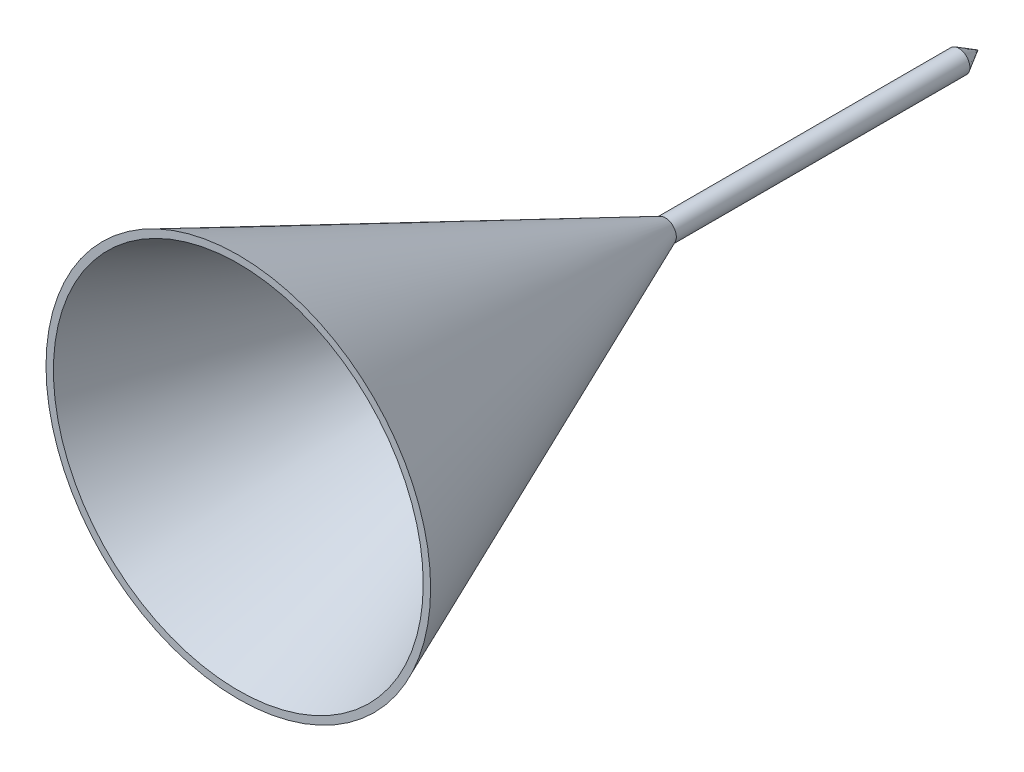
ISO-10303-21;
HEADER;
FILE_DESCRIPTION(('STEP AP214'),'2;1');
FILE_NAME('part.step','',(''),(''),'','','');
FILE_SCHEMA(('AUTOMOTIVE_DESIGN { 1 0 10303 214 1 1 1 1 }'));
ENDSEC;
DATA;
#1=APPLICATION_CONTEXT('core data for automotive mechanical design processes');
#2=APPLICATION_PROTOCOL_DEFINITION('international standard','automotive_design',2000,#1);
#3=PRODUCT_CONTEXT('',#1,'mechanical');
#4=PRODUCT('Part','Part','',(#3));
#5=PRODUCT_RELATED_PRODUCT_CATEGORY('part','',(#4));
#6=PRODUCT_DEFINITION_FORMATION('','',#4);
#7=PRODUCT_DEFINITION_CONTEXT('part definition',#1,'design');
#8=PRODUCT_DEFINITION('design','',#6,#7);
#9=PRODUCT_DEFINITION_SHAPE('','',#8);
#10=(LENGTH_UNIT() NAMED_UNIT(*) SI_UNIT(.MILLI.,.METRE.));
#11=(NAMED_UNIT(*) PLANE_ANGLE_UNIT() SI_UNIT($,.RADIAN.));
#12=(NAMED_UNIT(*) SI_UNIT($,.STERADIAN.) SOLID_ANGLE_UNIT());
#13=UNCERTAINTY_MEASURE_WITH_UNIT(LENGTH_MEASURE(1.E-05),#10,'distance_accuracy_value','');
#14=(GEOMETRIC_REPRESENTATION_CONTEXT(3) GLOBAL_UNCERTAINTY_ASSIGNED_CONTEXT((#13)) GLOBAL_UNIT_ASSIGNED_CONTEXT((#10,
#11,#12)) REPRESENTATION_CONTEXT('',''));
#15=CARTESIAN_POINT('',(0.,0.,0.));
#16=DIRECTION('',(0.,0.,1.));
#17=DIRECTION('',(1.,0.,0.));
#18=AXIS2_PLACEMENT_3D('',#15,#16,#17);
#19=CARTESIAN_POINT('',(0.,0.,-8796.28156351262));
#20=DIRECTION('',(0.,0.,1.));
#21=DIRECTION('',(1.,0.,0.));
#22=AXIS2_PLACEMENT_3D('',#19,#20,#21);
#23=CONICAL_SURFACE('',#22,76.2000000000001,0.4014257279587);
#24=CARTESIAN_POINT('',(0.,0.,0.));
#25=DIRECTION('',(0.,0.,1.));
#26=DIRECTION('',(1.,0.,0.));
#27=AXIS2_PLACEMENT_3D('',#24,#25,#26);
#28=CIRCLE('',#27,3810.);
#29=CARTESIAN_POINT('',(3810.,0.,-1.77635683940025E-12));
#30=VERTEX_POINT('',#29);
#31=EDGE_CURVE('E66',#30,#30,#28,.T.);
#32=CARTESIAN_POINT('',(0.,0.,-8796.28156351262));
#33=DIRECTION('',(0.,0.,1.));
#34=DIRECTION('',(1.,0.,0.));
#35=AXIS2_PLACEMENT_3D('',#32,#33,#34);
#36=CIRCLE('',#35,76.2000000000001);
#37=CARTESIAN_POINT('',(76.1999999999997,0.,-8796.28156351262));
#38=VERTEX_POINT('',#37);
#39=EDGE_CURVE('E11',#38,#38,#36,.T.);
#40=CARTESIAN_POINT('',(3810.,0.,-1.77635683940025E-12));
#41=CARTESIAN_POINT('',(3771.10625,0.,-91.6279329532577));
#42=CARTESIAN_POINT('',(3732.2125,0.,-183.255865906514));
#43=CARTESIAN_POINT('',(3654.425,0.,-366.511731813027));
#44=CARTESIAN_POINT('',(3615.53125,0.,-458.139664766284));
#45=CARTESIAN_POINT('',(3537.74375,0.,-641.395530672797));
#46=CARTESIAN_POINT('',(3498.85,0.,-733.023463626054));
#47=CARTESIAN_POINT('',(3421.0625,0.,-916.279329532567));
#48=CARTESIAN_POINT('',(3382.16875,0.,-1007.90726248582));
#49=CARTESIAN_POINT('',(3304.38125,0.,-1191.16312839234));
#50=CARTESIAN_POINT('',(3265.4875,0.,-1282.79106134559));
#51=CARTESIAN_POINT('',(3187.7,0.,-1466.0469272521));
#52=CARTESIAN_POINT('',(3148.80625,0.,-1557.67486020536));
#53=CARTESIAN_POINT('',(3071.01875,0.,-1740.93072611187));
#54=CARTESIAN_POINT('',(3032.125,0.,-1832.55865906513));
#55=CARTESIAN_POINT('',(2954.3375,0.,-2015.81452497164));
#56=CARTESIAN_POINT('',(2915.44375,0.,-2107.4424579249));
#57=CARTESIAN_POINT('',(2837.65625,0.,-2290.69832383141));
#58=CARTESIAN_POINT('',(2798.7625,0.,-2382.32625678467));
#59=CARTESIAN_POINT('',(2720.975,0.,-2565.58212269118));
#60=CARTESIAN_POINT('',(2682.08125,0.,-2657.21005564444));
#61=CARTESIAN_POINT('',(2604.29375,0.,-2840.46592155095));
#62=CARTESIAN_POINT('',(2565.4,0.,-2932.09385450421));
#63=CARTESIAN_POINT('',(2487.6125,0.,-3115.34972041072));
#64=CARTESIAN_POINT('',(2448.71875,0.,-3206.97765336398));
#65=CARTESIAN_POINT('',(2370.93125,0.,-3390.23351927049));
#66=CARTESIAN_POINT('',(2332.0375,0.,-3481.86145222375));
#67=CARTESIAN_POINT('',(2254.25,0.,-3665.11731813026));
#68=CARTESIAN_POINT('',(2215.35625,0.,-3756.74525108352));
#69=CARTESIAN_POINT('',(2137.56875,0.,-3940.00111699003));
#70=CARTESIAN_POINT('',(2098.675,0.,-4031.62904994328));
#71=CARTESIAN_POINT('',(2020.8875,0.,-4214.8849158498));
#72=CARTESIAN_POINT('',(1981.99375,0.,-4306.51284880305));
#73=CARTESIAN_POINT('',(1904.20625,0.,-4489.76871470957));
#74=CARTESIAN_POINT('',(1865.3125,0.,-4581.39664766282));
#75=CARTESIAN_POINT('',(1787.525,0.,-4764.65251356934));
#76=CARTESIAN_POINT('',(1748.63125,0.,-4856.28044652259));
#77=CARTESIAN_POINT('',(1670.84375,0.,-5039.53631242911));
#78=CARTESIAN_POINT('',(1631.95,0.,-5131.16424538236));
#79=CARTESIAN_POINT('',(1554.1625,0.,-5314.42011128888));
#80=CARTESIAN_POINT('',(1515.26875,0.,-5406.04804424213));
#81=CARTESIAN_POINT('',(1437.48125,0.,-5589.30391014864));
#82=CARTESIAN_POINT('',(1398.5875,0.,-5680.9318431019));
#83=CARTESIAN_POINT('',(1320.8,0.,-5864.18770900841));
#84=CARTESIAN_POINT('',(1281.90625,0.,-5955.81564196167));
#85=CARTESIAN_POINT('',(1204.11875,0.,-6139.07150786818));
#86=CARTESIAN_POINT('',(1165.225,0.,-6230.69944082144));
#87=CARTESIAN_POINT('',(1087.4375,0.,-6413.95530672795));
#88=CARTESIAN_POINT('',(1048.54375,0.,-6505.58323968121));
#89=CARTESIAN_POINT('',(970.75625,0.,-6688.83910558772));
#90=CARTESIAN_POINT('',(931.8625,0.,-6780.46703854098));
#91=CARTESIAN_POINT('',(854.075,0.,-6963.72290444749));
#92=CARTESIAN_POINT('',(815.18125,0.,-7055.35083740075));
#93=CARTESIAN_POINT('',(737.39375,0.,-7238.60670330726));
#94=CARTESIAN_POINT('',(698.5,0.,-7330.23463626052));
#95=CARTESIAN_POINT('',(620.7125,0.,-7513.49050216703));
#96=CARTESIAN_POINT('',(581.81875,0.,-7605.11843512029));
#97=CARTESIAN_POINT('',(504.03125,0.,-7788.3743010268));
#98=CARTESIAN_POINT('',(465.1375,0.,-7880.00223398006));
#99=CARTESIAN_POINT('',(387.35,0.,-8063.25809988657));
#100=CARTESIAN_POINT('',(348.45625,0.,-8154.88603283982));
#101=CARTESIAN_POINT('',(270.66875,0.,-8338.14189874634));
#102=CARTESIAN_POINT('',(231.775,0.,-8429.7698316996));
#103=CARTESIAN_POINT('',(153.9875,0.,-8613.02569760611));
#104=CARTESIAN_POINT('',(115.09375,0.,-8704.65363055936));
#105=CARTESIAN_POINT('',(76.2000000000001,0.,-8796.28156351262));
#106=B_SPLINE_CURVE_WITH_KNOTS('',3,(#40,#41,#42,#43,#44,#45,#46,#47,#48,#49,#50,#51,#52,#53,
#54,#55,#56,#57,#58,#59,#60,#61,#62,#63,#64,#65,#66,#67,#68,#69,#70,#71,#72,#73,#74,#75,#76,#77,
#78,#79,#80,#81,#82,#83,#84,#85,#86,#87,#88,#89,#90,#91,#92,#93,#94,#95,#96,#97,#98,#99,#100,
#101,#102,#103,#104,#105),.UNSPECIFIED.,.F.,.F.,(4,2,2,2,2,2,2,2,2,2,2,2,2,2,2,2,2,2,2,2,2,2,2,
2,2,2,2,2,2,2,2,2,4),(0.,298.6228674719,597.245734943803,895.868602415704,1194.49146988761,
1493.11433735951,1791.73720483141,2090.36007230331,2388.98293977521,2687.60580724711,
2986.22867471901,3284.85154219091,3583.47440966281,3882.09727713472,4180.72014460662,
4479.34301207852,4777.96587955042,5076.58874702232,5375.21161449422,5673.83448196612,
5972.45734943802,6271.08021690993,6569.70308438183,6868.32595185373,7166.94881932563,
7465.57168679753,7764.19455426943,8062.81742174133,8361.44028921323,8660.06315668513,
8958.68602415703,9257.30889162894,9555.93175910084),.UNSPECIFIED.);
#107=EDGE_CURVE('BSEAM34',#30,#38,#106,.T.);
#108=ORIENTED_EDGE('',*,*,#31,.T.);
#109=ORIENTED_EDGE('',*,*,#39,.F.);
#110=ORIENTED_EDGE('',*,*,#107,.T.);
#111=ORIENTED_EDGE('',*,*,#107,.F.);
#112=EDGE_LOOP('',(#108,#110,#109,#111));
#113=FACE_BOUND('',#112,.T.);
#114=ADVANCED_FACE('F34',(#113),#23,.F.);
#115=CARTESIAN_POINT('',(0.,0.,0.));
#116=DIRECTION('',(0.,0.,1.));
#117=DIRECTION('',(1.,0.,0.));
#118=AXIS2_PLACEMENT_3D('',#115,#116,#117);
#119=CYLINDRICAL_SURFACE('',#118,76.2000000000001);
#120=ORIENTED_EDGE('',*,*,#39,.T.);
#121=EDGE_LOOP('',(#120));
#122=FACE_BOUND('',#121,.T.);
#123=CARTESIAN_POINT('',(0.,0.,-14879.4177284633));
#124=DIRECTION('',(0.,0.,1.));
#125=DIRECTION('',(1.,0.,0.));
#126=AXIS2_PLACEMENT_3D('',#123,#124,#125);
#127=CIRCLE('',#126,76.2);
#128=CARTESIAN_POINT('',(76.2,0.,-14879.4177284633));
#129=VERTEX_POINT('',#128);
#130=EDGE_CURVE('E41',#129,#129,#127,.T.);
#131=ORIENTED_EDGE('',*,*,#130,.F.);
#132=EDGE_LOOP('',(#131));
#133=FACE_BOUND('',#132,.T.);
#134=ADVANCED_FACE('F83',(#122,#133),#119,.F.);
#135=CARTESIAN_POINT('',(0.,0.,-15011.4));
#136=DIRECTION('',(0.,0.,1.));
#137=DIRECTION('',(1.,0.,0.));
#138=AXIS2_PLACEMENT_3D('',#135,#136,#137);
#139=CONICAL_SURFACE('',#138,0.,0.523598775598302);
#140=ORIENTED_EDGE('',*,*,#130,.T.);
#141=EDGE_LOOP('',(#140));
#142=FACE_BOUND('',#141,.T.);
#143=CARTESIAN_POINT('',(0.,0.,-15011.4));
#144=VERTEX_POINT('',#143);
#145=VERTEX_LOOP('',#144);
#146=FACE_BOUND('',#145,.T.);
#147=ADVANCED_FACE('F51',(#142,#146),#139,.F.);
#148=CARTESIAN_POINT('',(0.,0.,-14844.0531853898));
#149=DIRECTION('',(0.,0.,1.));
#150=DIRECTION('',(1.,0.,0.));
#151=AXIS2_PLACEMENT_3D('',#148,#149,#150);
#152=CONICAL_SURFACE('',#151,228.599999999998,0.523598775598302);
#153=CARTESIAN_POINT('',(0.,0.,-15240.));
#154=VERTEX_POINT('',#153);
#155=VERTEX_LOOP('',#154);
#156=FACE_BOUND('',#155,.T.);
#157=CARTESIAN_POINT('',(0.,0.,-14844.0531853898));
#158=DIRECTION('',(0.,0.,1.));
#159=DIRECTION('',(1.,0.,0.));
#160=AXIS2_PLACEMENT_3D('',#157,#158,#159);
#161=CIRCLE('',#160,228.599999999998);
#162=CARTESIAN_POINT('',(228.599999999998,0.,-14844.0531853898));
#163=VERTEX_POINT('',#162);
#164=EDGE_CURVE('E55',#163,#163,#161,.T.);
#165=ORIENTED_EDGE('',*,*,#164,.F.);
#166=EDGE_LOOP('',(#165));
#167=FACE_BOUND('',#166,.T.);
#168=ADVANCED_FACE('F47',(#156,#167),#152,.T.);
#169=CARTESIAN_POINT('',(0.,0.,0.));
#170=DIRECTION('',(0.,0.,1.));
#171=DIRECTION('',(1.,0.,0.));
#172=AXIS2_PLACEMENT_3D('',#169,#170,#171);
#173=CYLINDRICAL_SURFACE('',#172,228.599999999998);
#174=ORIENTED_EDGE('',*,*,#164,.T.);
#175=EDGE_LOOP('',(#174));
#176=FACE_BOUND('',#175,.T.);
#177=CARTESIAN_POINT('',(0.,0.,-8796.28156351262));
#178=DIRECTION('',(0.,0.,1.));
#179=DIRECTION('',(1.,0.,0.));
#180=AXIS2_PLACEMENT_3D('',#177,#178,#179);
#181=CIRCLE('',#180,228.599999999998);
#182=CARTESIAN_POINT('',(228.599999999998,0.,-8796.28156351262));
#183=VERTEX_POINT('',#182);
#184=EDGE_CURVE('E57',#183,#183,#181,.T.);
#185=ORIENTED_EDGE('',*,*,#184,.F.);
#186=EDGE_LOOP('',(#185));
#187=FACE_BOUND('',#186,.T.);
#188=ADVANCED_FACE('F50',(#176,#187),#173,.T.);
#189=CARTESIAN_POINT('',(0.,0.,0.));
#190=DIRECTION('',(0.,0.,1.));
#191=DIRECTION('',(1.,0.,0.));
#192=AXIS2_PLACEMENT_3D('',#189,#190,#191);
#193=CONICAL_SURFACE('',#192,3962.4,0.4014257279587);
#194=CARTESIAN_POINT('',(0.,0.,0.));
#195=DIRECTION('',(0.,0.,1.));
#196=DIRECTION('',(1.,0.,0.));
#197=AXIS2_PLACEMENT_3D('',#194,#195,#196);
#198=CIRCLE('',#197,3962.4);
#199=CARTESIAN_POINT('',(3962.4,0.,0.));
#200=VERTEX_POINT('',#199);
#201=EDGE_CURVE('E61',#200,#200,#198,.T.);
#202=CARTESIAN_POINT('',(228.599999999998,0.,-8796.28156351262));
#203=CARTESIAN_POINT('',(267.493749999998,0.,-8704.65363055937));
#204=CARTESIAN_POINT('',(306.387499999998,0.,-8613.02569760611));
#205=CARTESIAN_POINT('',(384.174999999998,0.,-8429.7698316996));
#206=CARTESIAN_POINT('',(423.068749999998,0.,-8338.14189874634));
#207=CARTESIAN_POINT('',(500.856249999998,0.,-8154.88603283983));
#208=CARTESIAN_POINT('',(539.749999999998,0.,-8063.25809988657));
#209=CARTESIAN_POINT('',(617.537499999998,0.,-7880.00223398006));
#210=CARTESIAN_POINT('',(656.431249999998,0.,-7788.3743010268));
#211=CARTESIAN_POINT('',(734.218749999998,0.,-7605.11843512029));
#212=CARTESIAN_POINT('',(773.112499999998,0.,-7513.49050216703));
#213=CARTESIAN_POINT('',(850.899999999998,0.,-7330.23463626052));
#214=CARTESIAN_POINT('',(889.793749999998,0.,-7238.60670330726));
#215=CARTESIAN_POINT('',(967.581249999998,0.,-7055.35083740075));
#216=CARTESIAN_POINT('',(1006.475,0.,-6963.72290444749));
#217=CARTESIAN_POINT('',(1084.2625,0.,-6780.46703854098));
#218=CARTESIAN_POINT('',(1123.15625,0.,-6688.83910558772));
#219=CARTESIAN_POINT('',(1200.94375,0.,-6505.58323968121));
#220=CARTESIAN_POINT('',(1239.8375,0.,-6413.95530672795));
#221=CARTESIAN_POINT('',(1317.625,0.,-6230.69944082144));
#222=CARTESIAN_POINT('',(1356.51875,0.,-6139.07150786818));
#223=CARTESIAN_POINT('',(1434.30625,0.,-5955.81564196167));
#224=CARTESIAN_POINT('',(1473.2,0.,-5864.18770900841));
#225=CARTESIAN_POINT('',(1550.9875,0.,-5680.9318431019));
#226=CARTESIAN_POINT('',(1589.88125,0.,-5589.30391014865));
#227=CARTESIAN_POINT('',(1667.66875,0.,-5406.04804424213));
#228=CARTESIAN_POINT('',(1706.5625,0.,-5314.42011128888));
#229=CARTESIAN_POINT('',(1784.35,0.,-5131.16424538236));
#230=CARTESIAN_POINT('',(1823.24375,0.,-5039.53631242911));
#231=CARTESIAN_POINT('',(1901.03125,0.,-4856.28044652259));
#232=CARTESIAN_POINT('',(1939.925,0.,-4764.65251356934));
#233=CARTESIAN_POINT('',(2017.7125,0.,-4581.39664766282));
#234=CARTESIAN_POINT('',(2056.60625,0.,-4489.76871470957));
#235=CARTESIAN_POINT('',(2134.39375,0.,-4306.51284880305));
#236=CARTESIAN_POINT('',(2173.2875,0.,-4214.8849158498));
#237=CARTESIAN_POINT('',(2251.075,0.,-4031.62904994328));
#238=CARTESIAN_POINT('',(2289.96875,0.,-3940.00111699003));
#239=CARTESIAN_POINT('',(2367.75625,0.,-3756.74525108352));
#240=CARTESIAN_POINT('',(2406.65,0.,-3665.11731813026));
#241=CARTESIAN_POINT('',(2484.4375,0.,-3481.86145222375));
#242=CARTESIAN_POINT('',(2523.33125,0.,-3390.23351927049));
#243=CARTESIAN_POINT('',(2601.11875,0.,-3206.97765336398));
#244=CARTESIAN_POINT('',(2640.0125,0.,-3115.34972041072));
#245=CARTESIAN_POINT('',(2717.8,0.,-2932.09385450421));
#246=CARTESIAN_POINT('',(2756.69375,0.,-2840.46592155095));
#247=CARTESIAN_POINT('',(2834.48125,0.,-2657.21005564444));
#248=CARTESIAN_POINT('',(2873.375,0.,-2565.58212269118));
#249=CARTESIAN_POINT('',(2951.1625,0.,-2382.32625678467));
#250=CARTESIAN_POINT('',(2990.05625,0.,-2290.69832383141));
#251=CARTESIAN_POINT('',(3067.84375,0.,-2107.4424579249));
#252=CARTESIAN_POINT('',(3106.7375,0.,-2015.81452497164));
#253=CARTESIAN_POINT('',(3184.525,0.,-1832.55865906513));
#254=CARTESIAN_POINT('',(3223.41875,0.,-1740.93072611187));
#255=CARTESIAN_POINT('',(3301.20625,0.,-1557.67486020536));
#256=CARTESIAN_POINT('',(3340.1,0.,-1466.0469272521));
#257=CARTESIAN_POINT('',(3417.8875,0.,-1282.79106134559));
#258=CARTESIAN_POINT('',(3456.78125,0.,-1191.16312839233));
#259=CARTESIAN_POINT('',(3534.56875,0.,-1007.90726248582));
#260=CARTESIAN_POINT('',(3573.4625,0.,-916.279329532565));
#261=CARTESIAN_POINT('',(3651.25,0.,-733.023463626052));
#262=CARTESIAN_POINT('',(3690.14375,0.,-641.395530672795));
#263=CARTESIAN_POINT('',(3767.93125,0.,-458.139664766282));
#264=CARTESIAN_POINT('',(3806.825,0.,-366.511731813025));
#265=CARTESIAN_POINT('',(3884.6125,0.,-183.255865906512));
#266=CARTESIAN_POINT('',(3923.50625,0.,-91.6279329532562));
#267=CARTESIAN_POINT('',(3962.4,0.,0.));
#268=B_SPLINE_CURVE_WITH_KNOTS('',3,(#202,#203,#204,#205,#206,#207,#208,#209,#210,#211,#212,
#213,#214,#215,#216,#217,#218,#219,#220,#221,#222,#223,#224,#225,#226,#227,#228,#229,#230,#231,
#232,#233,#234,#235,#236,#237,#238,#239,#240,#241,#242,#243,#244,#245,#246,#247,#248,#249,#250,
#251,#252,#253,#254,#255,#256,#257,#258,#259,#260,#261,#262,#263,#264,#265,#266,#267),
.UNSPECIFIED.,.F.,.F.,(4,2,2,2,2,2,2,2,2,2,2,2,2,2,2,2,2,2,2,2,2,2,2,2,2,2,2,2,2,2,2,2,4),(0.,
298.6228674719,597.245734943803,895.868602415704,1194.49146988761,1493.11433735951,
1791.73720483141,2090.36007230331,2388.98293977521,2687.60580724711,2986.22867471901,
3284.85154219091,3583.47440966282,3882.09727713472,4180.72014460662,4479.34301207852,
4777.96587955042,5076.58874702232,5375.21161449422,5673.83448196613,5972.45734943803,
6271.08021690993,6569.70308438183,6868.32595185373,7166.94881932563,7465.57168679753,
7764.19455426943,8062.81742174134,8361.44028921324,8660.06315668514,8958.68602415704,
9257.30889162894,9555.93175910084),.UNSPECIFIED.);
#269=EDGE_CURVE('BSEAM74',#183,#200,#268,.T.);
#270=ORIENTED_EDGE('',*,*,#184,.T.);
#271=ORIENTED_EDGE('',*,*,#201,.F.);
#272=ORIENTED_EDGE('',*,*,#269,.T.);
#273=ORIENTED_EDGE('',*,*,#269,.F.);
#274=EDGE_LOOP('',(#270,#272,#271,#273));
#275=FACE_BOUND('',#274,.T.);
#276=ADVANCED_FACE('F74',(#275),#193,.T.);
#277=CARTESIAN_POINT('',(3810.,0.,0.));
#278=DIRECTION('',(0.,0.,1.));
#279=DIRECTION('',(1.,0.,0.));
#280=AXIS2_PLACEMENT_3D('',#277,#278,#279);
#281=PLANE('',#280);
#282=ORIENTED_EDGE('',*,*,#201,.T.);
#283=EDGE_LOOP('',(#282));
#284=FACE_BOUND('',#283,.T.);
#285=ORIENTED_EDGE('',*,*,#31,.F.);
#286=EDGE_LOOP('',(#285));
#287=FACE_BOUND('',#286,.T.);
#288=ADVANCED_FACE('F72',(#284,#287),#281,.T.);
#289=CLOSED_SHELL('',(#114,#134,#147,#168,#188,#276,#288));
#290=MANIFOLD_SOLID_BREP('B2',#289);
#291=ADVANCED_BREP_SHAPE_REPRESENTATION('',(#18,#290),#14);
#292=SHAPE_DEFINITION_REPRESENTATION(#9,#291);
ENDSEC;
END-ISO-10303-21;
